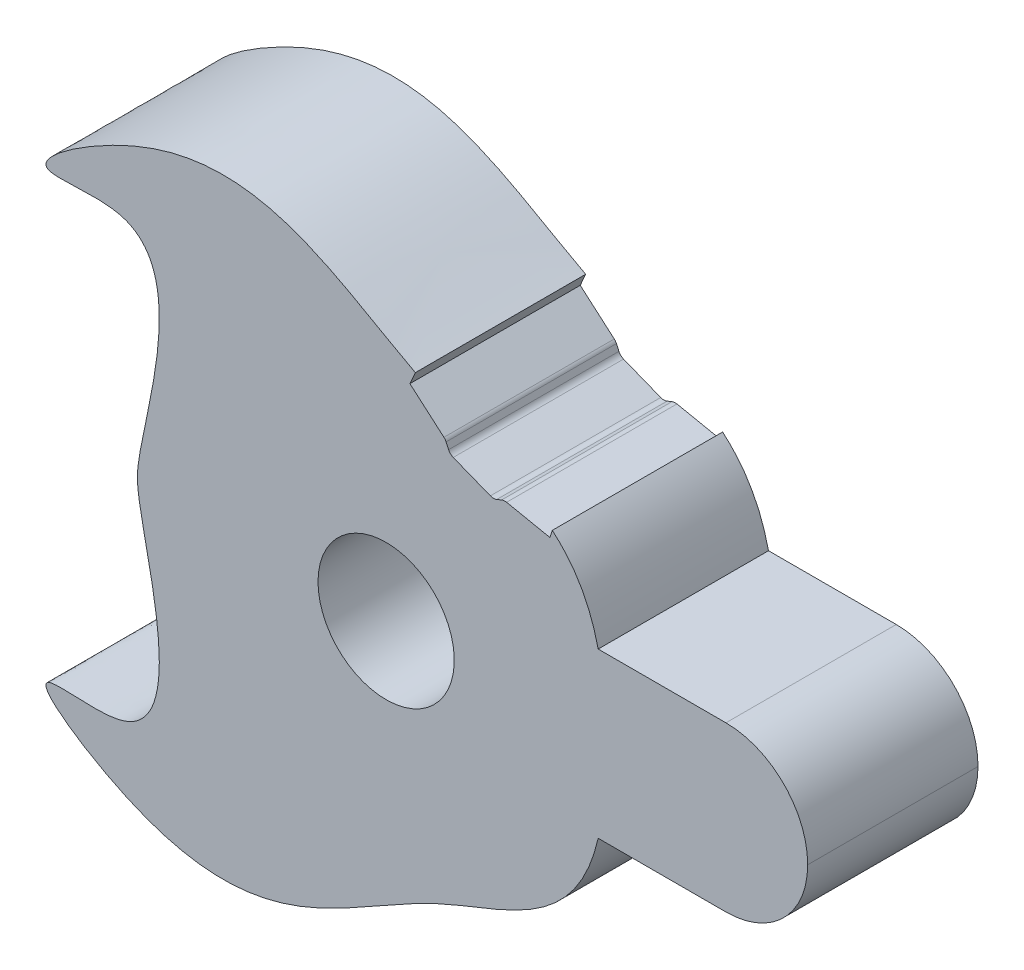
ISO-10303-21;
HEADER;
FILE_DESCRIPTION(('STEP AP214'),'2;1');
FILE_NAME('part.step','',(''),(''),'','','');
FILE_SCHEMA(('AUTOMOTIVE_DESIGN { 1 0 10303 214 1 1 1 1 }'));
ENDSEC;
DATA;
#1=APPLICATION_CONTEXT('core data for automotive mechanical design processes');
#2=APPLICATION_PROTOCOL_DEFINITION('international standard','automotive_design',2000,#1);
#3=PRODUCT_CONTEXT('',#1,'mechanical');
#4=PRODUCT('Part','Part','',(#3));
#5=PRODUCT_RELATED_PRODUCT_CATEGORY('part','',(#4));
#6=PRODUCT_DEFINITION_FORMATION('','',#4);
#7=PRODUCT_DEFINITION_CONTEXT('part definition',#1,'design');
#8=PRODUCT_DEFINITION('design','',#6,#7);
#9=PRODUCT_DEFINITION_SHAPE('','',#8);
#10=(LENGTH_UNIT() NAMED_UNIT(*) SI_UNIT(.MILLI.,.METRE.));
#11=(NAMED_UNIT(*) PLANE_ANGLE_UNIT() SI_UNIT($,.RADIAN.));
#12=(NAMED_UNIT(*) SI_UNIT($,.STERADIAN.) SOLID_ANGLE_UNIT());
#13=UNCERTAINTY_MEASURE_WITH_UNIT(LENGTH_MEASURE(1.E-05),#10,'distance_accuracy_value','');
#14=(GEOMETRIC_REPRESENTATION_CONTEXT(3) GLOBAL_UNCERTAINTY_ASSIGNED_CONTEXT((#13)) GLOBAL_UNIT_ASSIGNED_CONTEXT((#10,
#11,#12)) REPRESENTATION_CONTEXT('',''));
#15=CARTESIAN_POINT('',(0.,0.,0.));
#16=DIRECTION('',(0.,0.,1.));
#17=DIRECTION('',(1.,0.,0.));
#18=AXIS2_PLACEMENT_3D('',#15,#16,#17);
#19=CARTESIAN_POINT('',(42.41,9.62,10.));
#20=CARTESIAN_POINT('',(39.8489632571772,20.7775621220334,10.));
#21=CARTESIAN_POINT('',(18.657131981016,24.2037426905331,10.));
#22=CARTESIAN_POINT('',(0.622807134154034,43.5441205740642,10.));
#23=CARTESIAN_POINT('',(-27.8844782866782,24.1434186887991,10.));
#24=CARTESIAN_POINT('',(-2.35563921879009,29.3499902298277,10.));
#25=CARTESIAN_POINT('',(-11.8392775557161,4.89447251742595,10.));
#26=CARTESIAN_POINT('',(-11.6928477947035,0.,10.));
#27=B_SPLINE_CURVE_WITH_KNOTS('',3,(#19,#20,#21,#22,#23,#24,#25,#26),.UNSPECIFIED.,.F.,.F.,(4,1,
1,1,1,4),(0.,0.226721625159105,0.566757183860695,0.680002466795844,0.758939831056462,1.),.UNSPECIFIED.);
#28=DIRECTION('',(0.,0.,-1.));
#29=VECTOR('',#28,1.);
#30=SURFACE_OF_LINEAR_EXTRUSION('',#27,#29);
#31=CARTESIAN_POINT('',(42.41,9.62,-10.));
#32=CARTESIAN_POINT('',(39.8489632571772,20.7775621220334,-10.));
#33=CARTESIAN_POINT('',(18.657131981016,24.2037426905331,-10.));
#34=CARTESIAN_POINT('',(0.622807134154034,43.5441205740642,-10.));
#35=CARTESIAN_POINT('',(-27.8844782866782,24.1434186887991,-10.));
#36=CARTESIAN_POINT('',(-2.35563921879009,29.3499902298277,-10.));
#37=CARTESIAN_POINT('',(-11.8392775557161,4.89447251742595,-10.));
#38=CARTESIAN_POINT('',(-11.6928477947035,0.,-10.));
#39=B_SPLINE_CURVE_WITH_KNOTS('',3,(#31,#32,#33,#34,#35,#36,#37,#38),.UNSPECIFIED.,.F.,.F.,(4,1,
1,1,1,4),(0.,0.226721625159105,0.566757183860695,0.680002466795844,0.758939831056462,1.),.UNSPECIFIED.);
#40=CARTESIAN_POINT('',(42.41,9.62,-10.));
#41=VERTEX_POINT('',#40);
#42=CARTESIAN_POINT('',(37.0204168236413,18.9982844844054,-10.));
#43=VERTEX_POINT('',#42);
#44=EDGE_CURVE('E262',#41,#43,#39,.T.);
#45=ORIENTED_EDGE('',*,*,#44,.T.);
#46=DIRECTION('',(0.,0.,-1.));
#47=VECTOR('',#46,1.);
#48=CARTESIAN_POINT('',(37.0204168236413,18.9982844844054,10.));
#49=LINE('',#48,#47);
#50=CARTESIAN_POINT('',(37.0204168242404,18.9982844862989,10.));
#51=VERTEX_POINT('',#50);
#52=EDGE_CURVE('E264',#43,#51,#49,.F.);
#53=ORIENTED_EDGE('',*,*,#52,.T.);
#54=CARTESIAN_POINT('',(42.41,9.62,10.));
#55=VERTEX_POINT('',#54);
#56=EDGE_CURVE('E209',#55,#51,#27,.T.);
#57=ORIENTED_EDGE('',*,*,#56,.F.);
#58=DIRECTION('',(0.,0.,-1.));
#59=VECTOR('',#58,1.);
#60=CARTESIAN_POINT('',(42.41,9.62,10.));
#61=LINE('',#60,#59);
#62=EDGE_CURVE('E263',#55,#41,#61,.T.);
#63=ORIENTED_EDGE('',*,*,#62,.T.);
#64=EDGE_LOOP('',(#45,#53,#57,#63));
#65=FACE_BOUND('',#64,.T.);
#66=ADVANCED_FACE('F39',(#65),#30,.F.);
#67=CARTESIAN_POINT('',(42.41,-9.62,10.));
#68=CARTESIAN_POINT('',(39.8489632571772,-20.7775621220334,10.));
#69=CARTESIAN_POINT('',(18.657131981016,-24.2037426905331,10.));
#70=CARTESIAN_POINT('',(0.62280713415404,-43.5441205740642,10.));
#71=CARTESIAN_POINT('',(-27.8844782866782,-24.1434186887991,10.));
#72=CARTESIAN_POINT('',(-2.35563921879008,-29.3499902298277,10.));
#73=CARTESIAN_POINT('',(-11.8392775557161,-4.89447251742595,10.));
#74=CARTESIAN_POINT('',(-11.6928477947035,0.,10.));
#75=B_SPLINE_CURVE_WITH_KNOTS('',3,(#67,#68,#69,#70,#71,#72,#73,#74),.UNSPECIFIED.,.F.,.F.,(4,1,
1,1,1,4),(0.,0.226721625159105,0.566757183860695,0.680002466795844,0.758939831056462,1.),.UNSPECIFIED.);
#76=DIRECTION('',(0.,0.,-1.));
#77=VECTOR('',#76,1.);
#78=SURFACE_OF_LINEAR_EXTRUSION('',#75,#77);
#79=DIRECTION('',(0.,0.,-1.));
#80=VECTOR('',#79,1.);
#81=CARTESIAN_POINT('',(-22.4306296504081,-26.4749084888894,10.));
#82=LINE('',#81,#80);
#83=CARTESIAN_POINT('',(-22.4306296504931,-26.4749084910004,-10.));
#84=VERTEX_POINT('',#83);
#85=CARTESIAN_POINT('',(-22.4306296504931,-26.4749084910004,10.));
#86=VERTEX_POINT('',#85);
#87=EDGE_CURVE('E304',#84,#86,#82,.F.);
#88=ORIENTED_EDGE('',*,*,#87,.F.);
#89=CARTESIAN_POINT('',(42.41,-9.62,-10.));
#90=CARTESIAN_POINT('',(39.8489632571772,-20.7775621220334,-10.));
#91=CARTESIAN_POINT('',(18.657131981016,-24.2037426905331,-10.));
#92=CARTESIAN_POINT('',(0.62280713415404,-43.5441205740642,-10.));
#93=CARTESIAN_POINT('',(-27.8844782866782,-24.1434186887991,-10.));
#94=CARTESIAN_POINT('',(-2.35563921879008,-29.3499902298277,-10.));
#95=CARTESIAN_POINT('',(-11.8392775557161,-4.89447251742595,-10.));
#96=CARTESIAN_POINT('',(-11.6928477947035,0.,-10.));
#97=B_SPLINE_CURVE_WITH_KNOTS('',3,(#89,#90,#91,#92,#93,#94,#95,#96),.UNSPECIFIED.,.F.,.F.,(4,1,
1,1,1,4),(0.,0.226721625159105,0.566757183860695,0.680002466795844,0.758939831056462,1.),.UNSPECIFIED.);
#98=CARTESIAN_POINT('',(42.41,-9.62,-10.));
#99=VERTEX_POINT('',#98);
#100=EDGE_CURVE('E353',#99,#84,#97,.T.);
#101=ORIENTED_EDGE('',*,*,#100,.F.);
#102=DIRECTION('',(0.,0.,-1.));
#103=VECTOR('',#102,1.);
#104=CARTESIAN_POINT('',(42.41,-9.62,10.));
#105=LINE('',#104,#103);
#106=CARTESIAN_POINT('',(42.41,-9.62,10.));
#107=VERTEX_POINT('',#106);
#108=EDGE_CURVE('E221',#107,#99,#105,.T.);
#109=ORIENTED_EDGE('',*,*,#108,.F.);
#110=EDGE_CURVE('E341',#107,#86,#75,.T.);
#111=ORIENTED_EDGE('',*,*,#110,.T.);
#112=EDGE_LOOP('',(#88,#101,#109,#111));
#113=FACE_BOUND('',#112,.T.);
#114=ADVANCED_FACE('F235',(#113),#78,.T.);
#115=CARTESIAN_POINT('',(20.94,26.9987394330648,10.));
#116=VERTEX_POINT('',#115);
#117=CARTESIAN_POINT('',(-11.6934036882869,0.0199998879170253,10.));
#118=VERTEX_POINT('',#117);
#119=EDGE_CURVE('E198',#116,#118,#27,.T.);
#120=ORIENTED_EDGE('',*,*,#119,.F.);
#121=DIRECTION('',(0.,0.,1.));
#122=VECTOR('',#121,1.);
#123=CARTESIAN_POINT('',(20.94,26.9987394330648,-10.0052083342376));
#124=LINE('',#123,#122);
#125=CARTESIAN_POINT('',(20.94,26.9987394330648,-10.));
#126=VERTEX_POINT('',#125);
#127=EDGE_CURVE('E181',#126,#116,#124,.T.);
#128=ORIENTED_EDGE('',*,*,#127,.F.);
#129=CARTESIAN_POINT('',(-11.6934036882869,0.0199998879170253,-10.));
#130=VERTEX_POINT('',#129);
#131=EDGE_CURVE('E268',#126,#130,#39,.T.);
#132=ORIENTED_EDGE('',*,*,#131,.T.);
#133=DIRECTION('',(0.,0.,-1.));
#134=VECTOR('',#133,1.);
#135=CARTESIAN_POINT('',(-11.6934036911664,0.0199999999999499,10.));
#136=LINE('',#135,#134);
#137=EDGE_CURVE('E206',#130,#118,#136,.F.);
#138=ORIENTED_EDGE('',*,*,#137,.T.);
#139=EDGE_LOOP('',(#120,#128,#132,#138));
#140=FACE_BOUND('',#139,.T.);
#141=ADVANCED_FACE('F207',(#140),#30,.F.);
#142=CARTESIAN_POINT('',(17.51,0.019999999999995,10.));
#143=DIRECTION('',(0.,0.,-1.));
#144=DIRECTION('',(-1.,0.,0.));
#145=AXIS2_PLACEMENT_3D('',#142,#143,#144);
#146=CYLINDRICAL_SURFACE('',#145,8.00000000000421);
#147=CARTESIAN_POINT('',(17.51,0.019999999999995,-10.));
#148=DIRECTION('',(0.,0.,-1.));
#149=DIRECTION('',(-1.,0.,0.));
#150=AXIS2_PLACEMENT_3D('',#147,#148,#149);
#151=CIRCLE('',#150,8.00000000000421);
#152=CARTESIAN_POINT('',(9.50999999999579,0.019999999999995,-10.));
#153=VERTEX_POINT('',#152);
#154=EDGE_CURVE('E267',#153,#153,#151,.T.);
#155=ORIENTED_EDGE('',*,*,#154,.T.);
#156=EDGE_LOOP('',(#155));
#157=FACE_BOUND('',#156,.T.);
#158=CARTESIAN_POINT('',(17.51,0.019999999999995,10.));
#159=DIRECTION('',(0.,0.,-1.));
#160=DIRECTION('',(-1.,0.,0.));
#161=AXIS2_PLACEMENT_3D('',#158,#159,#160);
#162=CIRCLE('',#161,8.00000000000421);
#163=CARTESIAN_POINT('',(9.50999999999579,0.019999999999995,10.));
#164=VERTEX_POINT('',#163);
#165=EDGE_CURVE('E215',#164,#164,#162,.T.);
#166=ORIENTED_EDGE('',*,*,#165,.F.);
#167=EDGE_LOOP('',(#166));
#168=FACE_BOUND('',#167,.T.);
#169=ADVANCED_FACE('F233',(#157,#168),#146,.F.);
#170=CARTESIAN_POINT('',(57.4100000000042,0.020000000000001,10.));
#171=DIRECTION('',(0.,0.,-1.));
#172=DIRECTION('',(-1.,0.,0.));
#173=AXIS2_PLACEMENT_3D('',#170,#171,#172);
#174=CYLINDRICAL_SURFACE('',#173,9.6);
#175=CARTESIAN_POINT('',(57.4100000000042,0.020000000000001,-10.));
#176=DIRECTION('',(0.,0.,1.));
#177=DIRECTION('',(1.,0.,0.));
#178=AXIS2_PLACEMENT_3D('',#175,#176,#177);
#179=CIRCLE('',#178,9.6);
#180=CARTESIAN_POINT('',(67.0099583331567,-0.0199999999999919,-10.));
#181=VERTEX_POINT('',#180);
#182=CARTESIAN_POINT('',(57.4100000000042,9.62,-10.));
#183=VERTEX_POINT('',#182);
#184=EDGE_CURVE('E213',#181,#183,#179,.T.);
#185=ORIENTED_EDGE('',*,*,#184,.T.);
#186=DIRECTION('',(0.,0.,-1.));
#187=VECTOR('',#186,1.);
#188=CARTESIAN_POINT('',(57.4100000000042,9.62,10.));
#189=LINE('',#188,#187);
#190=CARTESIAN_POINT('',(57.4100000000042,9.62,10.));
#191=VERTEX_POINT('',#190);
#192=EDGE_CURVE('E282',#191,#183,#189,.T.);
#193=ORIENTED_EDGE('',*,*,#192,.F.);
#194=CARTESIAN_POINT('',(57.4100000000042,0.020000000000001,10.));
#195=DIRECTION('',(0.,0.,1.));
#196=DIRECTION('',(1.,0.,0.));
#197=AXIS2_PLACEMENT_3D('',#194,#195,#196);
#198=CIRCLE('',#197,9.6);
#199=CARTESIAN_POINT('',(67.0099583331567,-0.0199999999999919,10.));
#200=VERTEX_POINT('',#199);
#201=EDGE_CURVE('E372',#200,#191,#198,.T.);
#202=ORIENTED_EDGE('',*,*,#201,.F.);
#203=CARTESIAN_POINT('',(67.0099166663092,-0.0199999999999855,10.));
#204=DIRECTION('',(0.,0.,-1.));
#205=VECTOR('',#204,1.);
#206=LINE('',#203,#205);
#207=EDGE_CURVE('E281',#200,#181,#206,.T.);
#208=ORIENTED_EDGE('',*,*,#207,.T.);
#209=EDGE_LOOP('',(#185,#193,#202,#208));
#210=FACE_BOUND('',#209,.T.);
#211=ADVANCED_FACE('F375',(#210),#174,.T.);
#212=CARTESIAN_POINT('',(42.41,9.62,10.));
#213=DIRECTION('',(0.,-1.,0.));
#214=DIRECTION('',(0.,0.,-1.));
#215=AXIS2_PLACEMENT_3D('',#212,#213,#214);
#216=PLANE('',#215);
#217=DIRECTION('',(-1.,0.,0.));
#218=VECTOR('',#217,1.);
#219=CARTESIAN_POINT('',(42.41,9.62,-10.));
#220=LINE('',#219,#218);
#221=EDGE_CURVE('E208',#183,#41,#220,.T.);
#222=ORIENTED_EDGE('',*,*,#221,.T.);
#223=ORIENTED_EDGE('',*,*,#62,.F.);
#224=DIRECTION('',(-1.,0.,0.));
#225=VECTOR('',#224,1.);
#226=CARTESIAN_POINT('',(42.41,9.62,10.));
#227=LINE('',#226,#225);
#228=EDGE_CURVE('E273',#191,#55,#227,.T.);
#229=ORIENTED_EDGE('',*,*,#228,.F.);
#230=ORIENTED_EDGE('',*,*,#192,.T.);
#231=EDGE_LOOP('',(#222,#223,#229,#230));
#232=FACE_BOUND('',#231,.T.);
#233=ADVANCED_FACE('F521',(#232),#216,.F.);
#234=CARTESIAN_POINT('',(-3.64439699495435,35.7402287616117,10.));
#235=DIRECTION('',(0.,0.,1.));
#236=DIRECTION('',(1.,0.,0.));
#237=AXIS2_PLACEMENT_3D('',#234,#235,#236);
#238=PLANE('',#237);
#239=DIRECTION('',(0.979721760093609,-0.200362852842241,0.));
#240=VECTOR('',#239,1.);
#241=CARTESIAN_POINT('',(36.7456781564355,18.13,10.));
#242=LINE('',#241,#240);
#243=CARTESIAN_POINT('',(31.6567394772739,19.1707386190939,10.));
#244=VERTEX_POINT('',#243);
#245=CARTESIAN_POINT('',(36.7456781564355,18.13,10.));
#246=VERTEX_POINT('',#245);
#247=EDGE_CURVE('E454',#244,#246,#242,.T.);
#248=ORIENTED_EDGE('',*,*,#247,.F.);
#249=CARTESIAN_POINT('',(31.4563766244317,18.1910168590003,10.));
#250=DIRECTION('',(0.,0.,1.));
#251=DIRECTION('',(1.,0.,0.));
#252=AXIS2_PLACEMENT_3D('',#249,#250,#251);
#253=CIRCLE('',#252,1.);
#254=CARTESIAN_POINT('',(31.074631501962,19.1152844941961,10.));
#255=VERTEX_POINT('',#254);
#256=EDGE_CURVE('E404',#244,#255,#253,.T.);
#257=ORIENTED_EDGE('',*,*,#256,.T.);
#258=DIRECTION('',(0.924267635195892,0.381745122469683,0.));
#259=VECTOR('',#258,1.);
#260=CARTESIAN_POINT('',(31.3572084759206,19.2319956906323,10.));
#261=LINE('',#260,#259);
#262=CARTESIAN_POINT('',(30.5008496808999,18.8782985788495,10.));
#263=VERTEX_POINT('',#262);
#264=EDGE_CURVE('E446',#263,#255,#261,.T.);
#265=ORIENTED_EDGE('',*,*,#264,.F.);
#266=CARTESIAN_POINT('',(30.1191045584302,19.8025662140453,10.));
#267=DIRECTION('',(0.,0.,1.));
#268=DIRECTION('',(1.,0.,0.));
#269=AXIS2_PLACEMENT_3D('',#266,#267,#268);
#270=CIRCLE('',#269,1.);
#271=CARTESIAN_POINT('',(29.7516587692747,18.8725212731786,10.));
#272=VERTEX_POINT('',#271);
#273=EDGE_CURVE('E428',#263,#272,#270,.F.);
#274=ORIENTED_EDGE('',*,*,#273,.T.);
#275=DIRECTION('',(0.930044940866749,-0.367445789155577,0.));
#276=VECTOR('',#275,1.);
#277=CARTESIAN_POINT('',(30.1274213165901,18.724063537787,10.));
#278=LINE('',#277,#276);
#279=CARTESIAN_POINT('',(25.3879366891385,20.5965576427512,10.));
#280=VERTEX_POINT('',#279);
#281=EDGE_CURVE('E433',#280,#272,#278,.T.);
#282=ORIENTED_EDGE('',*,*,#281,.F.);
#283=CARTESIAN_POINT('',(25.7553824782941,21.5266025836179,10.));
#284=DIRECTION('',(0.,0.,1.));
#285=DIRECTION('',(1.,0.,0.));
#286=AXIS2_PLACEMENT_3D('',#283,#284,#285);
#287=CIRCLE('',#286,1.);
#288=CARTESIAN_POINT('',(24.8450005946115,21.1128335346757,10.));
#289=VERTEX_POINT('',#288);
#290=EDGE_CURVE('E50',#280,#289,#287,.F.);
#291=ORIENTED_EDGE('',*,*,#290,.T.);
#292=DIRECTION('',(0.413769048942224,-0.910381883682583,0.));
#293=VECTOR('',#292,1.);
#294=CARTESIAN_POINT('',(25.012174141823,20.7450153781427,10.));
#295=LINE('',#294,#293);
#296=CARTESIAN_POINT('',(24.5522648561105,21.7569158161296,10.));
#297=VERTEX_POINT('',#296);
#298=EDGE_CURVE('E435',#297,#289,#295,.T.);
#299=ORIENTED_EDGE('',*,*,#298,.F.);
#300=CARTESIAN_POINT('',(23.6418829724279,21.3431467671874,10.));
#301=DIRECTION('',(0.,0.,1.));
#302=DIRECTION('',(1.,0.,0.));
#303=AXIS2_PLACEMENT_3D('',#300,#301,#302);
#304=CIRCLE('',#303,1.);
#305=CARTESIAN_POINT('',(24.2959398820586,22.0995921115213,10.));
#306=VERTEX_POINT('',#305);
#307=EDGE_CURVE('E405',#297,#306,#304,.T.);
#308=ORIENTED_EDGE('',*,*,#307,.T.);
#309=DIRECTION('',(0.756445344333846,-0.654056909630691,0.));
#310=VECTOR('',#309,1.);
#311=CARTESIAN_POINT('',(24.4616324546095,21.9563268078702,10.));
#312=LINE('',#311,#310);
#313=CARTESIAN_POINT('',(20.3011830607734,25.553639810839,10.));
#314=VERTEX_POINT('',#313);
#315=EDGE_CURVE('E202',#314,#306,#312,.T.);
#316=ORIENTED_EDGE('',*,*,#315,.F.);
#317=DIRECTION('',(-0.404314518497846,-0.914620014066965,0.));
#318=VECTOR('',#317,1.);
#319=CARTESIAN_POINT('',(20.3011830607734,25.553639810839,10.));
#320=LINE('',#319,#318);
#321=EDGE_CURVE('E183',#116,#314,#320,.T.);
#322=ORIENTED_EDGE('',*,*,#321,.F.);
#323=ORIENTED_EDGE('',*,*,#119,.T.);
#324=CARTESIAN_POINT('',(42.41,-9.58,10.));
#325=CARTESIAN_POINT('',(39.8489632571772,-20.7375621220334,10.));
#326=CARTESIAN_POINT('',(18.657131981016,-24.1637426905331,10.));
#327=CARTESIAN_POINT('',(0.622807134154045,-43.5041205740642,10.));
#328=CARTESIAN_POINT('',(-27.8844782866782,-24.1034186887991,10.));
#329=CARTESIAN_POINT('',(-2.35563921879008,-29.3099902298277,10.));
#330=CARTESIAN_POINT('',(-11.8392775557161,-4.85447251742597,10.));
#331=CARTESIAN_POINT('',(-11.6928477947035,0.0399999999999828,10.));
#332=B_SPLINE_CURVE_WITH_KNOTS('',3,(#324,#325,#326,#327,#328,#329,#330,#331),.UNSPECIFIED.,.F.,
.F.,(4,1,1,1,1,4),(0.,0.226721625159105,0.566757183860695,0.680002466795844,0.758939831056462,
1.),.UNSPECIFIED.);
#333=CARTESIAN_POINT('',(-11.6950425893426,-0.13418821990436,10.));
#334=VERTEX_POINT('',#333);
#335=EDGE_CURVE('E465',#334,#118,#332,.T.);
#336=ORIENTED_EDGE('',*,*,#335,.F.);
#337=CARTESIAN_POINT('',(-9.12723532037753,-17.4357439020747,10.));
#338=VERTEX_POINT('',#337);
#339=EDGE_CURVE('E287',#338,#334,#75,.T.);
#340=ORIENTED_EDGE('',*,*,#339,.F.);
#341=EDGE_CURVE('E467',#86,#338,#332,.T.);
#342=ORIENTED_EDGE('',*,*,#341,.F.);
#343=ORIENTED_EDGE('',*,*,#110,.F.);
#344=DIRECTION('',(-1.,0.,0.));
#345=VECTOR('',#344,1.);
#346=CARTESIAN_POINT('',(42.41,-9.62,10.));
#347=LINE('',#346,#345);
#348=CARTESIAN_POINT('',(57.4100000000042,-9.61999999999999,10.));
#349=VERTEX_POINT('',#348);
#350=EDGE_CURVE('E298',#349,#107,#347,.T.);
#351=ORIENTED_EDGE('',*,*,#350,.F.);
#352=CARTESIAN_POINT('',(57.4100000000042,-0.0199999999999932,10.));
#353=DIRECTION('',(0.,0.,-1.));
#354=DIRECTION('',(1.,0.,0.));
#355=AXIS2_PLACEMENT_3D('',#352,#353,#354);
#356=CIRCLE('',#355,9.6);
#357=EDGE_CURVE('E292',#200,#349,#356,.T.);
#358=ORIENTED_EDGE('',*,*,#357,.F.);
#359=ORIENTED_EDGE('',*,*,#201,.T.);
#360=ORIENTED_EDGE('',*,*,#228,.T.);
#361=ORIENTED_EDGE('',*,*,#56,.T.);
#362=DIRECTION('',(0.301674054182524,0.953411120678315,0.));
#363=VECTOR('',#362,1.);
#364=CARTESIAN_POINT('',(37.6,20.83,10.));
#365=LINE('',#364,#363);
#366=EDGE_CURVE('E390',#246,#51,#365,.T.);
#367=ORIENTED_EDGE('',*,*,#366,.F.);
#368=EDGE_LOOP('',(#248,#257,#265,#274,#282,#291,#299,#308,#316,#322,#323,#336,#340,#342,#343,
#351,#358,#359,#360,#361,#367));
#369=FACE_BOUND('',#368,.T.);
#370=ORIENTED_EDGE('',*,*,#165,.T.);
#371=EDGE_LOOP('',(#370));
#372=FACE_BOUND('',#371,.T.);
#373=ADVANCED_FACE('F200',(#369,#372),#238,.T.);
#374=CARTESIAN_POINT('',(-3.64439699495435,35.7402287616117,-10.));
#375=DIRECTION('',(0.,0.,1.));
#376=DIRECTION('',(1.,0.,0.));
#377=AXIS2_PLACEMENT_3D('',#374,#375,#376);
#378=PLANE('',#377);
#379=DIRECTION('',(0.924267635195892,0.381745122469684,0.));
#380=VECTOR('',#379,1.);
#381=CARTESIAN_POINT('',(30.1274213165901,18.724063537787,-10.));
#382=LINE('',#381,#380);
#383=CARTESIAN_POINT('',(30.5008496808999,18.8782985788495,-10.));
#384=VERTEX_POINT('',#383);
#385=CARTESIAN_POINT('',(31.074631501962,19.1152844941961,-10.));
#386=VERTEX_POINT('',#385);
#387=EDGE_CURVE('E393',#384,#386,#382,.T.);
#388=ORIENTED_EDGE('',*,*,#387,.T.);
#389=CARTESIAN_POINT('',(31.4563766244317,18.1910168590003,-10.));
#390=DIRECTION('',(0.,0.,1.));
#391=DIRECTION('',(1.,0.,0.));
#392=AXIS2_PLACEMENT_3D('',#389,#390,#391);
#393=CIRCLE('',#392,1.);
#394=CARTESIAN_POINT('',(31.6567394772739,19.1707386190939,-10.));
#395=VERTEX_POINT('',#394);
#396=EDGE_CURVE('E414',#386,#395,#393,.F.);
#397=ORIENTED_EDGE('',*,*,#396,.T.);
#398=DIRECTION('',(0.979721760093609,-0.200362852842241,0.));
#399=VECTOR('',#398,1.);
#400=CARTESIAN_POINT('',(31.3572084759206,19.2319956906323,-10.));
#401=LINE('',#400,#399);
#402=CARTESIAN_POINT('',(36.7456781564355,18.13,-10.));
#403=VERTEX_POINT('',#402);
#404=EDGE_CURVE('E400',#395,#403,#401,.T.);
#405=ORIENTED_EDGE('',*,*,#404,.T.);
#406=DIRECTION('',(0.301674054182524,0.953411120678315,0.));
#407=VECTOR('',#406,1.);
#408=CARTESIAN_POINT('',(36.7456781564355,18.13,-10.));
#409=LINE('',#408,#407);
#410=EDGE_CURVE('E191',#403,#43,#409,.T.);
#411=ORIENTED_EDGE('',*,*,#410,.T.);
#412=ORIENTED_EDGE('',*,*,#44,.F.);
#413=ORIENTED_EDGE('',*,*,#221,.F.);
#414=ORIENTED_EDGE('',*,*,#184,.F.);
#415=CARTESIAN_POINT('',(57.4100000000042,-0.0199999999999932,-10.));
#416=DIRECTION('',(0.,0.,-1.));
#417=DIRECTION('',(1.,0.,0.));
#418=AXIS2_PLACEMENT_3D('',#415,#416,#417);
#419=CIRCLE('',#418,9.6);
#420=CARTESIAN_POINT('',(57.4100000000042,-9.61999999999999,-10.));
#421=VERTEX_POINT('',#420);
#422=EDGE_CURVE('E283',#181,#421,#419,.T.);
#423=ORIENTED_EDGE('',*,*,#422,.T.);
#424=DIRECTION('',(-1.,0.,0.));
#425=VECTOR('',#424,1.);
#426=CARTESIAN_POINT('',(42.41,-9.62,-10.));
#427=LINE('',#426,#425);
#428=EDGE_CURVE('E288',#421,#99,#427,.T.);
#429=ORIENTED_EDGE('',*,*,#428,.T.);
#430=ORIENTED_EDGE('',*,*,#100,.T.);
#431=CARTESIAN_POINT('',(42.41,-9.58,-10.));
#432=CARTESIAN_POINT('',(39.8489632571772,-20.7375621220334,-10.));
#433=CARTESIAN_POINT('',(18.657131981016,-24.1637426905331,-10.));
#434=CARTESIAN_POINT('',(0.622807134154045,-43.5041205740642,-10.));
#435=CARTESIAN_POINT('',(-27.8844782866782,-24.1034186887991,-10.));
#436=CARTESIAN_POINT('',(-2.35563921879008,-29.3099902298277,-10.));
#437=CARTESIAN_POINT('',(-11.8392775557161,-4.85447251742597,-10.));
#438=CARTESIAN_POINT('',(-11.6928477947035,0.0399999999999828,-10.));
#439=B_SPLINE_CURVE_WITH_KNOTS('',3,(#431,#432,#433,#434,#435,#436,#437,#438),.UNSPECIFIED.,.F.,
.F.,(4,1,1,1,1,4),(0.,0.226721625159105,0.566757183860695,0.680002466795844,0.758939831056462,
1.),.UNSPECIFIED.);
#440=CARTESIAN_POINT('',(-9.12723532037753,-17.4357439020747,-10.));
#441=VERTEX_POINT('',#440);
#442=EDGE_CURVE('E470',#84,#441,#439,.T.);
#443=ORIENTED_EDGE('',*,*,#442,.T.);
#444=CARTESIAN_POINT('',(-11.6950425893426,-0.13418821990436,-10.));
#445=VERTEX_POINT('',#444);
#446=EDGE_CURVE('E360',#441,#445,#97,.T.);
#447=ORIENTED_EDGE('',*,*,#446,.T.);
#448=EDGE_CURVE('E461',#445,#130,#439,.T.);
#449=ORIENTED_EDGE('',*,*,#448,.T.);
#450=ORIENTED_EDGE('',*,*,#131,.F.);
#451=DIRECTION('',(-0.404314518497846,-0.914620014066965,0.));
#452=VECTOR('',#451,1.);
#453=CARTESIAN_POINT('',(20.94,26.9987394330648,-10.));
#454=LINE('',#453,#452);
#455=CARTESIAN_POINT('',(20.3011830607734,25.553639810839,-10.));
#456=VERTEX_POINT('',#455);
#457=EDGE_CURVE('E190',#126,#456,#454,.T.);
#458=ORIENTED_EDGE('',*,*,#457,.T.);
#459=DIRECTION('',(0.756445344333846,-0.654056909630691,0.));
#460=VECTOR('',#459,1.);
#461=CARTESIAN_POINT('',(20.3011830607734,25.553639810839,-10.));
#462=LINE('',#461,#460);
#463=CARTESIAN_POINT('',(24.2959398820586,22.0995921115213,-10.));
#464=VERTEX_POINT('',#463);
#465=EDGE_CURVE('E386',#456,#464,#462,.T.);
#466=ORIENTED_EDGE('',*,*,#465,.T.);
#467=CARTESIAN_POINT('',(23.6418829724279,21.3431467671874,-10.));
#468=DIRECTION('',(0.,0.,1.));
#469=DIRECTION('',(1.,0.,0.));
#470=AXIS2_PLACEMENT_3D('',#467,#468,#469);
#471=CIRCLE('',#470,1.);
#472=CARTESIAN_POINT('',(24.5522648561105,21.7569158161296,-10.));
#473=VERTEX_POINT('',#472);
#474=EDGE_CURVE('E412',#464,#473,#471,.F.);
#475=ORIENTED_EDGE('',*,*,#474,.T.);
#476=DIRECTION('',(0.413769048942224,-0.910381883682583,0.));
#477=VECTOR('',#476,1.);
#478=CARTESIAN_POINT('',(24.4616324546095,21.9563268078702,-10.));
#479=LINE('',#478,#477);
#480=CARTESIAN_POINT('',(24.8450005946115,21.1128335346757,-10.));
#481=VERTEX_POINT('',#480);
#482=EDGE_CURVE('E392',#473,#481,#479,.T.);
#483=ORIENTED_EDGE('',*,*,#482,.T.);
#484=CARTESIAN_POINT('',(25.7553824782941,21.5266025836179,-10.));
#485=DIRECTION('',(0.,0.,1.));
#486=DIRECTION('',(1.,0.,0.));
#487=AXIS2_PLACEMENT_3D('',#484,#485,#486);
#488=CIRCLE('',#487,1.);
#489=CARTESIAN_POINT('',(25.3879366891385,20.5965576427512,-10.));
#490=VERTEX_POINT('',#489);
#491=EDGE_CURVE('E11',#481,#490,#488,.T.);
#492=ORIENTED_EDGE('',*,*,#491,.T.);
#493=DIRECTION('',(0.930044940866749,-0.367445789155577,0.));
#494=VECTOR('',#493,1.);
#495=CARTESIAN_POINT('',(25.012174141823,20.7450153781427,-10.));
#496=LINE('',#495,#494);
#497=CARTESIAN_POINT('',(29.7516587692747,18.8725212731786,-10.));
#498=VERTEX_POINT('',#497);
#499=EDGE_CURVE('E394',#490,#498,#496,.T.);
#500=ORIENTED_EDGE('',*,*,#499,.T.);
#501=CARTESIAN_POINT('',(30.1191045584302,19.8025662140453,-10.));
#502=DIRECTION('',(0.,0.,1.));
#503=DIRECTION('',(1.,0.,0.));
#504=AXIS2_PLACEMENT_3D('',#501,#502,#503);
#505=CIRCLE('',#504,1.);
#506=EDGE_CURVE('E426',#498,#384,#505,.T.);
#507=ORIENTED_EDGE('',*,*,#506,.T.);
#508=EDGE_LOOP('',(#388,#397,#405,#411,#412,#413,#414,#423,#429,#430,#443,#447,#449,#450,#458,
#466,#475,#483,#492,#500,#507));
#509=FACE_BOUND('',#508,.T.);
#510=ORIENTED_EDGE('',*,*,#154,.F.);
#511=EDGE_LOOP('',(#510));
#512=FACE_BOUND('',#511,.T.);
#513=ADVANCED_FACE('F339',(#509,#512),#378,.F.);
#514=DIRECTION('',(0.,0.,-1.));
#515=VECTOR('',#514,1.);
#516=CARTESIAN_POINT('',(-9.12723532402822,-17.4357397325106,10.));
#517=LINE('',#516,#515);
#518=EDGE_CURVE('E305',#338,#441,#517,.T.);
#519=ORIENTED_EDGE('',*,*,#518,.F.);
#520=ORIENTED_EDGE('',*,*,#339,.T.);
#521=DIRECTION('',(0.,0.,-1.));
#522=VECTOR('',#521,1.);
#523=CARTESIAN_POINT('',(-11.6950425882977,-0.13418792551863,10.));
#524=LINE('',#523,#522);
#525=EDGE_CURVE('E299',#445,#334,#524,.F.);
#526=ORIENTED_EDGE('',*,*,#525,.F.);
#527=ORIENTED_EDGE('',*,*,#446,.F.);
#528=EDGE_LOOP('',(#519,#520,#526,#527));
#529=FACE_BOUND('',#528,.T.);
#530=ADVANCED_FACE('F259',(#529),#78,.T.);
#531=CARTESIAN_POINT('',(42.41,-9.62,10.));
#532=DIRECTION('',(0.,-1.,0.));
#533=DIRECTION('',(1.,0.,0.));
#534=AXIS2_PLACEMENT_3D('',#531,#532,#533);
#535=PLANE('',#534);
#536=ORIENTED_EDGE('',*,*,#428,.F.);
#537=DIRECTION('',(0.,0.,-1.));
#538=VECTOR('',#537,1.);
#539=CARTESIAN_POINT('',(57.4100000000042,-9.61999999999999,10.));
#540=LINE('',#539,#538);
#541=EDGE_CURVE('E294',#349,#421,#540,.T.);
#542=ORIENTED_EDGE('',*,*,#541,.F.);
#543=ORIENTED_EDGE('',*,*,#350,.T.);
#544=ORIENTED_EDGE('',*,*,#108,.T.);
#545=EDGE_LOOP('',(#536,#542,#543,#544));
#546=FACE_BOUND('',#545,.T.);
#547=ADVANCED_FACE('F331',(#546),#535,.T.);
#548=CARTESIAN_POINT('',(57.4100000000042,-0.0199999999999932,10.));
#549=DIRECTION('',(0.,0.,-1.));
#550=DIRECTION('',(-1.,0.,0.));
#551=AXIS2_PLACEMENT_3D('',#548,#549,#550);
#552=CYLINDRICAL_SURFACE('',#551,9.6);
#553=ORIENTED_EDGE('',*,*,#422,.F.);
#554=ORIENTED_EDGE('',*,*,#207,.F.);
#555=ORIENTED_EDGE('',*,*,#357,.T.);
#556=ORIENTED_EDGE('',*,*,#541,.T.);
#557=EDGE_LOOP('',(#553,#554,#555,#556));
#558=FACE_BOUND('',#557,.T.);
#559=ADVANCED_FACE('F318',(#558),#552,.T.);
#560=DIRECTION('',(0.,0.,-1.));
#561=VECTOR('',#560,1.);
#562=SURFACE_OF_LINEAR_EXTRUSION('',#332,#561);
#563=ORIENTED_EDGE('',*,*,#137,.F.);
#564=ORIENTED_EDGE('',*,*,#448,.F.);
#565=ORIENTED_EDGE('',*,*,#525,.T.);
#566=ORIENTED_EDGE('',*,*,#335,.T.);
#567=EDGE_LOOP('',(#563,#564,#565,#566));
#568=FACE_BOUND('',#567,.T.);
#569=ADVANCED_FACE('F328',(#568),#562,.T.);
#570=ORIENTED_EDGE('',*,*,#442,.F.);
#571=ORIENTED_EDGE('',*,*,#87,.T.);
#572=ORIENTED_EDGE('',*,*,#341,.T.);
#573=ORIENTED_EDGE('',*,*,#518,.T.);
#574=EDGE_LOOP('',(#570,#571,#572,#573));
#575=FACE_BOUND('',#574,.T.);
#576=ADVANCED_FACE('F482',(#575),#562,.T.);
#577=CARTESIAN_POINT('',(37.6,20.83,-10.0052083342376));
#578=DIRECTION('',(0.953411120678315,-0.301674054182524,0.));
#579=DIRECTION('',(0.301674054182524,0.953411120678315,0.));
#580=AXIS2_PLACEMENT_3D('',#577,#578,#579);
#581=PLANE('',#580);
#582=ORIENTED_EDGE('',*,*,#410,.F.);
#583=DIRECTION('',(0.,0.,1.));
#584=VECTOR('',#583,1.);
#585=CARTESIAN_POINT('',(36.7456781564355,18.13,-10.0052083342376));
#586=LINE('',#585,#584);
#587=EDGE_CURVE('E460',#403,#246,#586,.T.);
#588=ORIENTED_EDGE('',*,*,#587,.T.);
#589=ORIENTED_EDGE('',*,*,#366,.T.);
#590=ORIENTED_EDGE('',*,*,#52,.F.);
#591=EDGE_LOOP('',(#582,#588,#589,#590));
#592=FACE_BOUND('',#591,.T.);
#593=ADVANCED_FACE('F490',(#592),#581,.F.);
#594=CARTESIAN_POINT('',(36.7456781564355,18.13,-10.0052083342376));
#595=DIRECTION('',(-0.200362852842241,-0.979721760093609,0.));
#596=DIRECTION('',(0.979721760093609,-0.200362852842241,0.));
#597=AXIS2_PLACEMENT_3D('',#594,#595,#596);
#598=PLANE('',#597);
#599=ORIENTED_EDGE('',*,*,#404,.F.);
#600=DIRECTION('',(0.,0.,1.));
#601=VECTOR('',#600,1.);
#602=CARTESIAN_POINT('',(31.6567394772739,19.1707386190939,-10.0052083342376));
#603=LINE('',#602,#601);
#604=EDGE_CURVE('E308',#395,#244,#603,.T.);
#605=ORIENTED_EDGE('',*,*,#604,.T.);
#606=ORIENTED_EDGE('',*,*,#247,.T.);
#607=ORIENTED_EDGE('',*,*,#587,.F.);
#608=EDGE_LOOP('',(#599,#605,#606,#607));
#609=FACE_BOUND('',#608,.T.);
#610=ADVANCED_FACE('F491',(#609),#598,.F.);
#611=CARTESIAN_POINT('',(31.3572084759206,19.2319956906323,-10.0052083342376));
#612=DIRECTION('',(0.381745122469683,-0.924267635195892,0.));
#613=DIRECTION('',(0.924267635195892,0.381745122469683,0.));
#614=AXIS2_PLACEMENT_3D('',#611,#612,#613);
#615=PLANE('',#614);
#616=ORIENTED_EDGE('',*,*,#264,.T.);
#617=DIRECTION('',(0.,0.,1.));
#618=VECTOR('',#617,1.);
#619=CARTESIAN_POINT('',(31.074631501962,19.1152844941961,-10.0052083342376));
#620=LINE('',#619,#618);
#621=EDGE_CURVE('E408',#255,#386,#620,.F.);
#622=ORIENTED_EDGE('',*,*,#621,.T.);
#623=ORIENTED_EDGE('',*,*,#387,.F.);
#624=DIRECTION('',(0.,0.,1.));
#625=VECTOR('',#624,1.);
#626=CARTESIAN_POINT('',(30.5008496808999,18.8782985788495,10.));
#627=LINE('',#626,#625);
#628=EDGE_CURVE('E409',#384,#263,#627,.T.);
#629=ORIENTED_EDGE('',*,*,#628,.T.);
#630=EDGE_LOOP('',(#616,#622,#623,#629));
#631=FACE_BOUND('',#630,.T.);
#632=ADVANCED_FACE('F449',(#631),#615,.F.);
#633=CARTESIAN_POINT('',(30.1274213165901,18.724063537787,-10.0052083342376));
#634=DIRECTION('',(-0.367445789155577,-0.930044940866749,0.));
#635=DIRECTION('',(0.930044940866749,-0.367445789155577,0.));
#636=AXIS2_PLACEMENT_3D('',#633,#634,#635);
#637=PLANE('',#636);
#638=ORIENTED_EDGE('',*,*,#281,.T.);
#639=DIRECTION('',(0.,0.,1.));
#640=VECTOR('',#639,1.);
#641=CARTESIAN_POINT('',(29.7516587692747,18.8725212731786,-10.));
#642=LINE('',#641,#640);
#643=EDGE_CURVE('E53',#272,#498,#642,.F.);
#644=ORIENTED_EDGE('',*,*,#643,.T.);
#645=ORIENTED_EDGE('',*,*,#499,.F.);
#646=DIRECTION('',(0.,0.,1.));
#647=VECTOR('',#646,1.);
#648=CARTESIAN_POINT('',(25.3879366891385,20.5965576427512,10.));
#649=LINE('',#648,#647);
#650=EDGE_CURVE('E413',#490,#280,#649,.T.);
#651=ORIENTED_EDGE('',*,*,#650,.T.);
#652=EDGE_LOOP('',(#638,#644,#645,#651));
#653=FACE_BOUND('',#652,.T.);
#654=ADVANCED_FACE('F441',(#653),#637,.F.);
#655=CARTESIAN_POINT('',(25.012174141823,20.7450153781427,-10.0052083342376));
#656=DIRECTION('',(-0.910381883682583,-0.413769048942223,0.));
#657=DIRECTION('',(0.413769048942224,-0.910381883682583,0.));
#658=AXIS2_PLACEMENT_3D('',#655,#656,#657);
#659=PLANE('',#658);
#660=ORIENTED_EDGE('',*,*,#298,.T.);
#661=DIRECTION('',(0.,0.,1.));
#662=VECTOR('',#661,1.);
#663=CARTESIAN_POINT('',(24.8450005946115,21.1128335346757,-10.));
#664=LINE('',#663,#662);
#665=EDGE_CURVE('E422',#289,#481,#664,.F.);
#666=ORIENTED_EDGE('',*,*,#665,.T.);
#667=ORIENTED_EDGE('',*,*,#482,.F.);
#668=DIRECTION('',(0.,0.,1.));
#669=VECTOR('',#668,1.);
#670=CARTESIAN_POINT('',(24.5522648561105,21.7569158161296,-10.0052083342376));
#671=LINE('',#670,#669);
#672=EDGE_CURVE('E418',#473,#297,#671,.T.);
#673=ORIENTED_EDGE('',*,*,#672,.T.);
#674=EDGE_LOOP('',(#660,#666,#667,#673));
#675=FACE_BOUND('',#674,.T.);
#676=ADVANCED_FACE('F440',(#675),#659,.F.);
#677=CARTESIAN_POINT('',(24.4616324546095,21.9563268078702,-10.0052083342376));
#678=DIRECTION('',(-0.654056909630691,-0.756445344333846,0.));
#679=DIRECTION('',(0.756445344333846,-0.654056909630691,0.));
#680=AXIS2_PLACEMENT_3D('',#677,#678,#679);
#681=PLANE('',#680);
#682=ORIENTED_EDGE('',*,*,#315,.T.);
#683=DIRECTION('',(0.,0.,1.));
#684=VECTOR('',#683,1.);
#685=CARTESIAN_POINT('',(24.2959398820586,22.0995921115213,-10.0052083342376));
#686=LINE('',#685,#684);
#687=EDGE_CURVE('E425',#306,#464,#686,.F.);
#688=ORIENTED_EDGE('',*,*,#687,.T.);
#689=ORIENTED_EDGE('',*,*,#465,.F.);
#690=DIRECTION('',(0.,0.,1.));
#691=VECTOR('',#690,1.);
#692=CARTESIAN_POINT('',(20.3011830607734,25.553639810839,-10.0052083342376));
#693=LINE('',#692,#691);
#694=EDGE_CURVE('E194',#456,#314,#693,.T.);
#695=ORIENTED_EDGE('',*,*,#694,.T.);
#696=EDGE_LOOP('',(#682,#688,#689,#695));
#697=FACE_BOUND('',#696,.T.);
#698=ADVANCED_FACE('F509',(#697),#681,.F.);
#699=CARTESIAN_POINT('',(20.3011830607734,25.553639810839,-10.0052083342376));
#700=DIRECTION('',(-0.914620014066965,0.404314518497846,0.));
#701=DIRECTION('',(-0.404314518497846,-0.914620014066965,0.));
#702=AXIS2_PLACEMENT_3D('',#699,#700,#701);
#703=PLANE('',#702);
#704=ORIENTED_EDGE('',*,*,#321,.T.);
#705=ORIENTED_EDGE('',*,*,#694,.F.);
#706=ORIENTED_EDGE('',*,*,#457,.F.);
#707=ORIENTED_EDGE('',*,*,#127,.T.);
#708=EDGE_LOOP('',(#704,#705,#706,#707));
#709=FACE_BOUND('',#708,.T.);
#710=ADVANCED_FACE('F182',(#709),#703,.F.);
#711=CARTESIAN_POINT('',(31.4563766244317,18.1910168590003,-10.0052083342376));
#712=DIRECTION('',(0.,0.,1.));
#713=DIRECTION('',(1.,0.,0.));
#714=AXIS2_PLACEMENT_3D('',#711,#712,#713);
#715=CYLINDRICAL_SURFACE('',#714,1.);
#716=ORIENTED_EDGE('',*,*,#396,.F.);
#717=ORIENTED_EDGE('',*,*,#621,.F.);
#718=ORIENTED_EDGE('',*,*,#256,.F.);
#719=ORIENTED_EDGE('',*,*,#604,.F.);
#720=EDGE_LOOP('',(#716,#717,#718,#719));
#721=FACE_BOUND('',#720,.T.);
#722=ADVANCED_FACE('F234',(#721),#715,.T.);
#723=CARTESIAN_POINT('',(30.1191045584302,19.8025662140453,-10.0052083342376));
#724=DIRECTION('',(0.,0.,-1.));
#725=DIRECTION('',(-1.,0.,0.));
#726=AXIS2_PLACEMENT_3D('',#723,#724,#725);
#727=CYLINDRICAL_SURFACE('',#726,1.);
#728=ORIENTED_EDGE('',*,*,#506,.F.);
#729=ORIENTED_EDGE('',*,*,#643,.F.);
#730=ORIENTED_EDGE('',*,*,#273,.F.);
#731=ORIENTED_EDGE('',*,*,#628,.F.);
#732=EDGE_LOOP('',(#728,#729,#730,#731));
#733=FACE_BOUND('',#732,.T.);
#734=ADVANCED_FACE('F240',(#733),#727,.F.);
#735=CARTESIAN_POINT('',(25.7553824782941,21.5266025836179,-10.0052083342376));
#736=DIRECTION('',(0.,0.,-1.));
#737=DIRECTION('',(-1.,0.,0.));
#738=AXIS2_PLACEMENT_3D('',#735,#736,#737);
#739=CYLINDRICAL_SURFACE('',#738,1.);
#740=ORIENTED_EDGE('',*,*,#491,.F.);
#741=ORIENTED_EDGE('',*,*,#665,.F.);
#742=ORIENTED_EDGE('',*,*,#290,.F.);
#743=ORIENTED_EDGE('',*,*,#650,.F.);
#744=EDGE_LOOP('',(#740,#741,#742,#743));
#745=FACE_BOUND('',#744,.T.);
#746=ADVANCED_FACE('F239',(#745),#739,.F.);
#747=CARTESIAN_POINT('',(23.6418829724279,21.3431467671874,-10.0052083342376));
#748=DIRECTION('',(0.,0.,1.));
#749=DIRECTION('',(1.,0.,0.));
#750=AXIS2_PLACEMENT_3D('',#747,#748,#749);
#751=CYLINDRICAL_SURFACE('',#750,1.);
#752=ORIENTED_EDGE('',*,*,#474,.F.);
#753=ORIENTED_EDGE('',*,*,#687,.F.);
#754=ORIENTED_EDGE('',*,*,#307,.F.);
#755=ORIENTED_EDGE('',*,*,#672,.F.);
#756=EDGE_LOOP('',(#752,#753,#754,#755));
#757=FACE_BOUND('',#756,.T.);
#758=ADVANCED_FACE('F41',(#757),#751,.T.);
#759=CLOSED_SHELL('',(#66,#114,#141,#169,#211,#233,#373,#513,#530,#547,#559,#569,#576,#593,#610,
#632,#654,#676,#698,#710,#722,#734,#746,#758));
#760=MANIFOLD_SOLID_BREP('B2',#759);
#761=ADVANCED_BREP_SHAPE_REPRESENTATION('',(#18,#760),#14);
#762=SHAPE_DEFINITION_REPRESENTATION(#9,#761);
ENDSEC;
END-ISO-10303-21;
